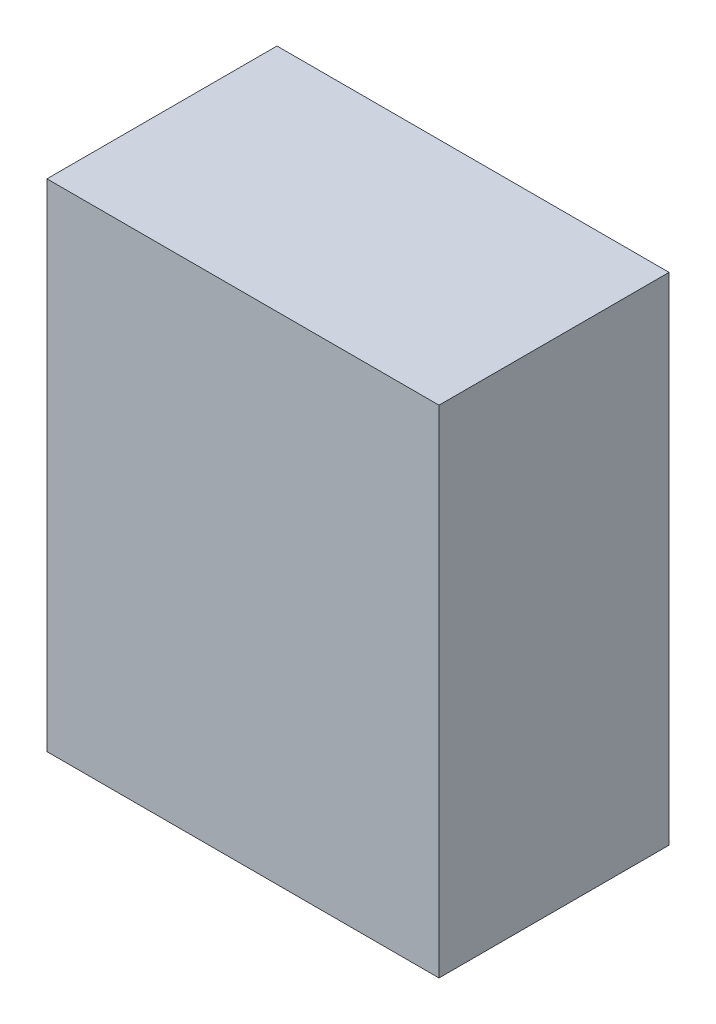
ISO-10303-21;
HEADER;
FILE_DESCRIPTION(('STEP AP214'),'2;1');
FILE_NAME('part.step','',(''),(''),'','','');
FILE_SCHEMA(('AUTOMOTIVE_DESIGN { 1 0 10303 214 1 1 1 1 }'));
ENDSEC;
DATA;
#1=APPLICATION_CONTEXT('core data for automotive mechanical design processes');
#2=APPLICATION_PROTOCOL_DEFINITION('international standard','automotive_design',2000,#1);
#3=PRODUCT_CONTEXT('',#1,'mechanical');
#4=PRODUCT('Part','Part','',(#3));
#5=PRODUCT_RELATED_PRODUCT_CATEGORY('part','',(#4));
#6=PRODUCT_DEFINITION_FORMATION('','',#4);
#7=PRODUCT_DEFINITION_CONTEXT('part definition',#1,'design');
#8=PRODUCT_DEFINITION('design','',#6,#7);
#9=PRODUCT_DEFINITION_SHAPE('','',#8);
#10=(LENGTH_UNIT() NAMED_UNIT(*) SI_UNIT(.MILLI.,.METRE.));
#11=(NAMED_UNIT(*) PLANE_ANGLE_UNIT() SI_UNIT($,.RADIAN.));
#12=(NAMED_UNIT(*) SI_UNIT($,.STERADIAN.) SOLID_ANGLE_UNIT());
#13=UNCERTAINTY_MEASURE_WITH_UNIT(LENGTH_MEASURE(1.E-05),#10,'distance_accuracy_value','');
#14=(GEOMETRIC_REPRESENTATION_CONTEXT(3) GLOBAL_UNCERTAINTY_ASSIGNED_CONTEXT((#13)) GLOBAL_UNIT_ASSIGNED_CONTEXT((#10,
#11,#12)) REPRESENTATION_CONTEXT('',''));
#15=CARTESIAN_POINT('',(0.,0.,0.));
#16=DIRECTION('',(0.,0.,1.));
#17=DIRECTION('',(1.,0.,0.));
#18=AXIS2_PLACEMENT_3D('',#15,#16,#17);
#19=CARTESIAN_POINT('',(87.,-162.2,258.875));
#20=DIRECTION('',(0.,0.,1.));
#21=DIRECTION('',(1.,0.,0.));
#22=AXIS2_PLACEMENT_3D('',#19,#20,#21);
#23=PLANE('',#22);
#24=DIRECTION('',(0.,1.,0.));
#25=VECTOR('',#24,1.);
#26=CARTESIAN_POINT('',(87.,-162.2,258.875));
#27=LINE('',#26,#25);
#28=CARTESIAN_POINT('',(87.,-162.2,258.875));
#29=VERTEX_POINT('',#28);
#30=CARTESIAN_POINT('',(87.,-149.8,258.875));
#31=VERTEX_POINT('',#30);
#32=EDGE_CURVE('E67',#29,#31,#27,.T.);
#33=ORIENTED_EDGE('',*,*,#32,.F.);
#34=DIRECTION('',(1.,0.,0.));
#35=VECTOR('',#34,1.);
#36=CARTESIAN_POINT('',(87.,-162.2,258.875));
#37=LINE('',#36,#35);
#38=CARTESIAN_POINT('',(96.8,-162.2,258.875));
#39=VERTEX_POINT('',#38);
#40=EDGE_CURVE('E91',#29,#39,#37,.T.);
#41=ORIENTED_EDGE('',*,*,#40,.T.);
#42=DIRECTION('',(0.,1.,0.));
#43=VECTOR('',#42,1.);
#44=CARTESIAN_POINT('',(96.8,-162.2,258.875));
#45=LINE('',#44,#43);
#46=CARTESIAN_POINT('',(96.8,-149.8,258.875));
#47=VERTEX_POINT('',#46);
#48=EDGE_CURVE('E69',#39,#47,#45,.T.);
#49=ORIENTED_EDGE('',*,*,#48,.T.);
#50=DIRECTION('',(1.,0.,0.));
#51=VECTOR('',#50,1.);
#52=CARTESIAN_POINT('',(87.,-149.8,258.875));
#53=LINE('',#52,#51);
#54=EDGE_CURVE('E10',#31,#47,#53,.T.);
#55=ORIENTED_EDGE('',*,*,#54,.F.);
#56=EDGE_LOOP('',(#33,#41,#49,#55));
#57=FACE_BOUND('',#56,.T.);
#58=ADVANCED_FACE('F15',(#57),#23,.T.);
#59=CARTESIAN_POINT('',(87.,-162.2,253.125));
#60=DIRECTION('',(0.,0.,1.));
#61=DIRECTION('',(1.,0.,0.));
#62=AXIS2_PLACEMENT_3D('',#59,#60,#61);
#63=PLANE('',#62);
#64=DIRECTION('',(1.,0.,0.));
#65=VECTOR('',#64,1.);
#66=CARTESIAN_POINT('',(87.,-149.8,253.125));
#67=LINE('',#66,#65);
#68=CARTESIAN_POINT('',(87.,-149.8,253.125));
#69=VERTEX_POINT('',#68);
#70=CARTESIAN_POINT('',(96.8,-149.8,253.125));
#71=VERTEX_POINT('',#70);
#72=EDGE_CURVE('E26',#69,#71,#67,.T.);
#73=ORIENTED_EDGE('',*,*,#72,.T.);
#74=DIRECTION('',(0.,1.,0.));
#75=VECTOR('',#74,1.);
#76=CARTESIAN_POINT('',(96.8,-162.2,253.125));
#77=LINE('',#76,#75);
#78=CARTESIAN_POINT('',(96.8,-162.2,253.125));
#79=VERTEX_POINT('',#78);
#80=EDGE_CURVE('E107',#79,#71,#77,.T.);
#81=ORIENTED_EDGE('',*,*,#80,.F.);
#82=DIRECTION('',(1.,0.,0.));
#83=VECTOR('',#82,1.);
#84=CARTESIAN_POINT('',(87.,-162.2,253.125));
#85=LINE('',#84,#83);
#86=CARTESIAN_POINT('',(87.,-162.2,253.125));
#87=VERTEX_POINT('',#86);
#88=EDGE_CURVE('E92',#87,#79,#85,.T.);
#89=ORIENTED_EDGE('',*,*,#88,.F.);
#90=DIRECTION('',(0.,1.,0.));
#91=VECTOR('',#90,1.);
#92=CARTESIAN_POINT('',(87.,-162.2,253.125));
#93=LINE('',#92,#91);
#94=EDGE_CURVE('E77',#87,#69,#93,.T.);
#95=ORIENTED_EDGE('',*,*,#94,.T.);
#96=EDGE_LOOP('',(#73,#81,#89,#95));
#97=FACE_BOUND('',#96,.T.);
#98=ADVANCED_FACE('F120',(#97),#63,.F.);
#99=CARTESIAN_POINT('',(87.,-149.8,253.125));
#100=DIRECTION('',(0.,1.,0.));
#101=DIRECTION('',(1.,0.,0.));
#102=AXIS2_PLACEMENT_3D('',#99,#100,#101);
#103=PLANE('',#102);
#104=ORIENTED_EDGE('',*,*,#72,.F.);
#105=DIRECTION('',(0.,0.,1.));
#106=VECTOR('',#105,1.);
#107=CARTESIAN_POINT('',(87.,-149.8,253.125));
#108=LINE('',#107,#106);
#109=EDGE_CURVE('E72',#69,#31,#108,.T.);
#110=ORIENTED_EDGE('',*,*,#109,.T.);
#111=ORIENTED_EDGE('',*,*,#54,.T.);
#112=DIRECTION('',(0.,0.,1.));
#113=VECTOR('',#112,1.);
#114=CARTESIAN_POINT('',(96.8,-149.8,253.125));
#115=LINE('',#114,#113);
#116=EDGE_CURVE('E89',#71,#47,#115,.T.);
#117=ORIENTED_EDGE('',*,*,#116,.F.);
#118=EDGE_LOOP('',(#104,#110,#111,#117));
#119=FACE_BOUND('',#118,.T.);
#120=ADVANCED_FACE('F73',(#119),#103,.T.);
#121=CARTESIAN_POINT('',(87.,-162.2,253.125));
#122=DIRECTION('',(0.,1.,0.));
#123=DIRECTION('',(1.,0.,0.));
#124=AXIS2_PLACEMENT_3D('',#121,#122,#123);
#125=PLANE('',#124);
#126=DIRECTION('',(0.,0.,1.));
#127=VECTOR('',#126,1.);
#128=CARTESIAN_POINT('',(96.8,-162.2,253.125));
#129=LINE('',#128,#127);
#130=EDGE_CURVE('E111',#79,#39,#129,.T.);
#131=ORIENTED_EDGE('',*,*,#130,.T.);
#132=ORIENTED_EDGE('',*,*,#40,.F.);
#133=DIRECTION('',(0.,0.,1.));
#134=VECTOR('',#133,1.);
#135=CARTESIAN_POINT('',(87.,-162.2,253.125));
#136=LINE('',#135,#134);
#137=EDGE_CURVE('E19',#87,#29,#136,.T.);
#138=ORIENTED_EDGE('',*,*,#137,.F.);
#139=ORIENTED_EDGE('',*,*,#88,.T.);
#140=EDGE_LOOP('',(#131,#132,#138,#139));
#141=FACE_BOUND('',#140,.T.);
#142=ADVANCED_FACE('F17',(#141),#125,.F.);
#143=CARTESIAN_POINT('',(96.8,-162.2,253.125));
#144=DIRECTION('',(1.,0.,0.));
#145=DIRECTION('',(0.,1.,0.));
#146=AXIS2_PLACEMENT_3D('',#143,#144,#145);
#147=PLANE('',#146);
#148=ORIENTED_EDGE('',*,*,#130,.F.);
#149=ORIENTED_EDGE('',*,*,#80,.T.);
#150=ORIENTED_EDGE('',*,*,#116,.T.);
#151=ORIENTED_EDGE('',*,*,#48,.F.);
#152=EDGE_LOOP('',(#148,#149,#150,#151));
#153=FACE_BOUND('',#152,.T.);
#154=ADVANCED_FACE('F143',(#153),#147,.T.);
#155=CARTESIAN_POINT('',(87.,-162.2,253.125));
#156=DIRECTION('',(1.,0.,0.));
#157=DIRECTION('',(0.,1.,0.));
#158=AXIS2_PLACEMENT_3D('',#155,#156,#157);
#159=PLANE('',#158);
#160=ORIENTED_EDGE('',*,*,#32,.T.);
#161=ORIENTED_EDGE('',*,*,#109,.F.);
#162=ORIENTED_EDGE('',*,*,#94,.F.);
#163=ORIENTED_EDGE('',*,*,#137,.T.);
#164=EDGE_LOOP('',(#160,#161,#162,#163));
#165=FACE_BOUND('',#164,.T.);
#166=ADVANCED_FACE('F80',(#165),#159,.F.);
#167=CLOSED_SHELL('',(#58,#98,#120,#142,#154,#166));
#168=MANIFOLD_SOLID_BREP('B1',#167);
#169=ADVANCED_BREP_SHAPE_REPRESENTATION('',(#18,#168),#14);
#170=SHAPE_DEFINITION_REPRESENTATION(#9,#169);
ENDSEC;
END-ISO-10303-21;
